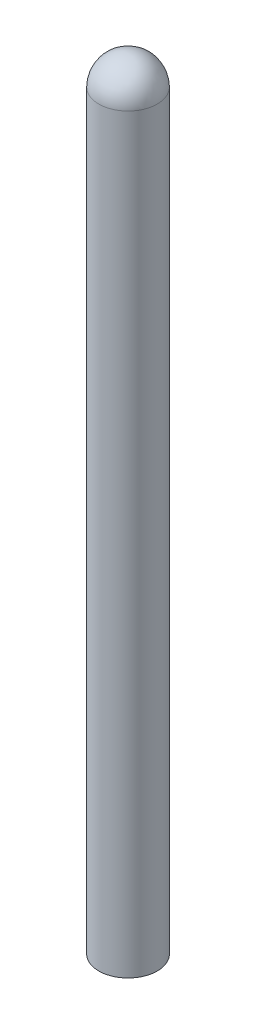
ISO-10303-21;
HEADER;
FILE_DESCRIPTION(('STEP AP214'),'2;1');
FILE_NAME('part.step','',(''),(''),'','','');
FILE_SCHEMA(('AUTOMOTIVE_DESIGN { 1 0 10303 214 1 1 1 1 }'));
ENDSEC;
DATA;
#1=APPLICATION_CONTEXT('core data for automotive mechanical design processes');
#2=APPLICATION_PROTOCOL_DEFINITION('international standard','automotive_design',2000,#1);
#3=PRODUCT_CONTEXT('',#1,'mechanical');
#4=PRODUCT('Part','Part','',(#3));
#5=PRODUCT_RELATED_PRODUCT_CATEGORY('part','',(#4));
#6=PRODUCT_DEFINITION_FORMATION('','',#4);
#7=PRODUCT_DEFINITION_CONTEXT('part definition',#1,'design');
#8=PRODUCT_DEFINITION('design','',#6,#7);
#9=PRODUCT_DEFINITION_SHAPE('','',#8);
#10=(LENGTH_UNIT() NAMED_UNIT(*) SI_UNIT(.MILLI.,.METRE.));
#11=(NAMED_UNIT(*) PLANE_ANGLE_UNIT() SI_UNIT($,.RADIAN.));
#12=(NAMED_UNIT(*) SI_UNIT($,.STERADIAN.) SOLID_ANGLE_UNIT());
#13=UNCERTAINTY_MEASURE_WITH_UNIT(LENGTH_MEASURE(1.E-05),#10,'distance_accuracy_value','');
#14=(GEOMETRIC_REPRESENTATION_CONTEXT(3) GLOBAL_UNCERTAINTY_ASSIGNED_CONTEXT((#13)) GLOBAL_UNIT_ASSIGNED_CONTEXT((#10,
#11,#12)) REPRESENTATION_CONTEXT('',''));
#15=CARTESIAN_POINT('',(0.,0.,0.));
#16=DIRECTION('',(0.,0.,1.));
#17=DIRECTION('',(1.,0.,0.));
#18=AXIS2_PLACEMENT_3D('',#15,#16,#17);
#19=CARTESIAN_POINT('',(0.,63.5,0.));
#20=DIRECTION('',(0.,-1.,0.));
#21=DIRECTION('',(0.,0.,-1.));
#22=AXIS2_PLACEMENT_3D('',#19,#20,#21);
#23=CYLINDRICAL_SURFACE('',#22,2.38125);
#24=CARTESIAN_POINT('',(0.,61.11875,0.));
#25=DIRECTION('',(0.,-1.,0.));
#26=DIRECTION('',(0.,0.,-1.));
#27=AXIS2_PLACEMENT_3D('',#24,#25,#26);
#28=CIRCLE('',#27,2.38125);
#29=CARTESIAN_POINT('',(0.,61.11875,-2.38125));
#30=VERTEX_POINT('',#29);
#31=EDGE_CURVE('E10',#30,#30,#28,.T.);
#32=ORIENTED_EDGE('',*,*,#31,.T.);
#33=EDGE_LOOP('',(#32));
#34=FACE_BOUND('',#33,.T.);
#35=CARTESIAN_POINT('',(0.,0.,0.));
#36=DIRECTION('',(0.,1.,0.));
#37=DIRECTION('',(0.,0.,1.));
#38=AXIS2_PLACEMENT_3D('',#35,#36,#37);
#39=CIRCLE('',#38,2.38125);
#40=CARTESIAN_POINT('',(0.,0.,2.38125));
#41=VERTEX_POINT('',#40);
#42=EDGE_CURVE('E37',#41,#41,#39,.T.);
#43=ORIENTED_EDGE('',*,*,#42,.T.);
#44=EDGE_LOOP('',(#43));
#45=FACE_BOUND('',#44,.T.);
#46=ADVANCED_FACE('F30',(#34,#45),#23,.T.);
#47=CARTESIAN_POINT('',(0.,0.,0.));
#48=DIRECTION('',(0.,1.,0.));
#49=DIRECTION('',(0.,0.,1.));
#50=AXIS2_PLACEMENT_3D('',#47,#48,#49);
#51=PLANE('',#50);
#52=ORIENTED_EDGE('',*,*,#42,.F.);
#53=EDGE_LOOP('',(#52));
#54=FACE_BOUND('',#53,.T.);
#55=ADVANCED_FACE('F44',(#54),#51,.F.);
#56=CARTESIAN_POINT('',(0.,61.11875,0.));
#57=DIRECTION('',(0.,0.,1.));
#58=DIRECTION('',(1.,0.,0.));
#59=AXIS2_PLACEMENT_3D('',#56,#57,#58);
#60=SPHERICAL_SURFACE('',#59,2.38125);
#61=CARTESIAN_POINT('',(0.,61.11875,0.));
#62=DIRECTION('',(0.,-1.,0.));
#63=DIRECTION('',(0.,0.,-1.));
#64=AXIS2_PLACEMENT_3D('',#61,#62,#63);
#65=SPHERICAL_SURFACE('',#64,2.38125);
#66=ORIENTED_EDGE('',*,*,#31,.F.);
#67=EDGE_LOOP('',(#66));
#68=FACE_BOUND('',#67,.T.);
#69=ADVANCED_FACE('F32',(#68),#65,.T.);
#70=CLOSED_SHELL('',(#46,#55,#69));
#71=MANIFOLD_SOLID_BREP('B2',#70);
#72=ADVANCED_BREP_SHAPE_REPRESENTATION('',(#18,#71),#14);
#73=SHAPE_DEFINITION_REPRESENTATION(#9,#72);
ENDSEC;
END-ISO-10303-21;
